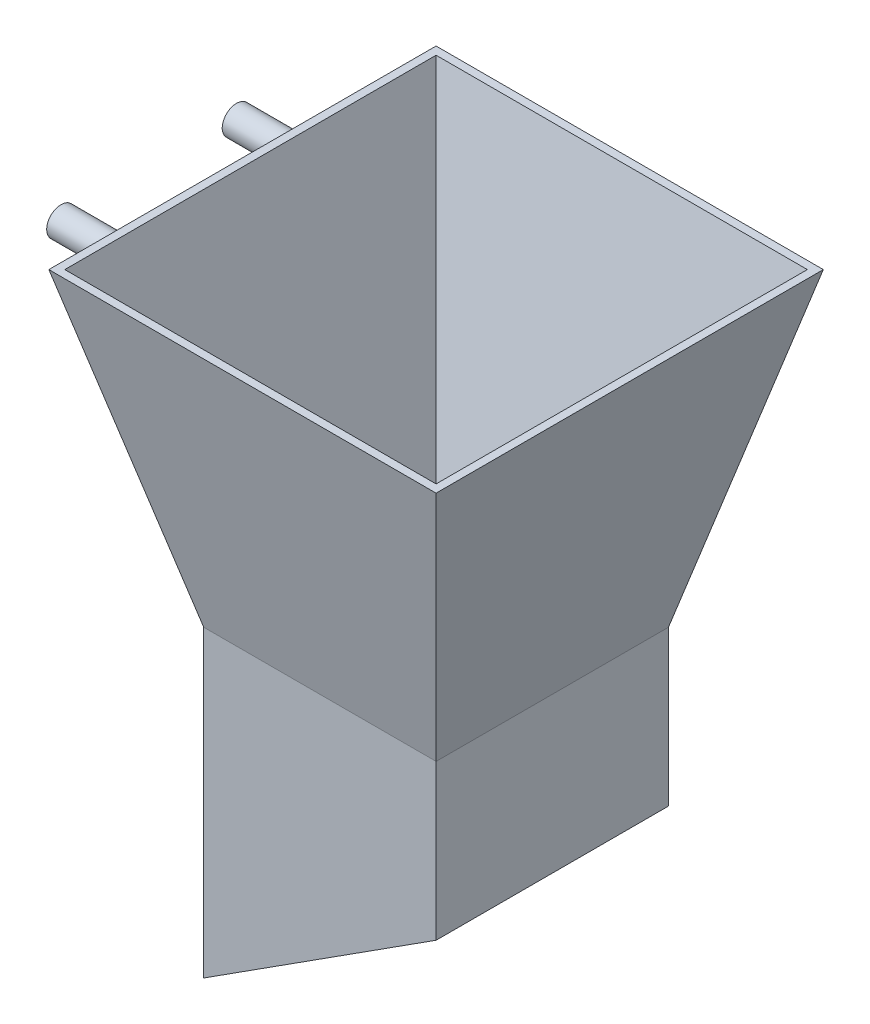
ISO-10303-21;
HEADER;
FILE_DESCRIPTION(('STEP AP214'),'2;1');
FILE_NAME('part.step','',(''),(''),'','','');
FILE_SCHEMA(('AUTOMOTIVE_DESIGN { 1 0 10303 214 1 1 1 1 }'));
ENDSEC;
DATA;
#1=APPLICATION_CONTEXT('core data for automotive mechanical design processes');
#2=APPLICATION_PROTOCOL_DEFINITION('international standard','automotive_design',2000,#1);
#3=PRODUCT_CONTEXT('',#1,'mechanical');
#4=PRODUCT('Part','Part','',(#3));
#5=PRODUCT_RELATED_PRODUCT_CATEGORY('part','',(#4));
#6=PRODUCT_DEFINITION_FORMATION('','',#4);
#7=PRODUCT_DEFINITION_CONTEXT('part definition',#1,'design');
#8=PRODUCT_DEFINITION('design','',#6,#7);
#9=PRODUCT_DEFINITION_SHAPE('','',#8);
#10=(LENGTH_UNIT() NAMED_UNIT(*) SI_UNIT(.MILLI.,.METRE.));
#11=(NAMED_UNIT(*) PLANE_ANGLE_UNIT() SI_UNIT($,.RADIAN.));
#12=(NAMED_UNIT(*) SI_UNIT($,.STERADIAN.) SOLID_ANGLE_UNIT());
#13=UNCERTAINTY_MEASURE_WITH_UNIT(LENGTH_MEASURE(1.E-05),#10,'distance_accuracy_value','');
#14=(GEOMETRIC_REPRESENTATION_CONTEXT(3) GLOBAL_UNCERTAINTY_ASSIGNED_CONTEXT((#13)) GLOBAL_UNIT_ASSIGNED_CONTEXT((#10,
#11,#12)) REPRESENTATION_CONTEXT('',''));
#15=CARTESIAN_POINT('',(0.,0.,0.));
#16=DIRECTION('',(0.,0.,1.));
#17=DIRECTION('',(1.,0.,0.));
#18=AXIS2_PLACEMENT_3D('',#15,#16,#17);
#19=CARTESIAN_POINT('',(-121.,-74.725401962788,-136.682880253871));
#20=DIRECTION('',(1.,0.,0.));
#21=DIRECTION('',(0.,0.,-1.));
#22=AXIS2_PLACEMENT_3D('',#19,#20,#21);
#23=CYLINDRICAL_SURFACE('',#22,18.4816077554572);
#24=CARTESIAN_POINT('',(-121.,-74.725401962788,-136.682880253871));
#25=DIRECTION('',(1.,0.,0.));
#26=DIRECTION('',(0.,0.,1.));
#27=AXIS2_PLACEMENT_3D('',#24,#25,#26);
#28=CIRCLE('',#27,18.4816077554572);
#29=CARTESIAN_POINT('',(-121.,-74.725401962788,-118.201272498414));
#30=VERTEX_POINT('',#29);
#31=EDGE_CURVE('E12',#30,#30,#28,.T.);
#32=ORIENTED_EDGE('',*,*,#31,.T.);
#33=EDGE_LOOP('',(#32));
#34=FACE_BOUND('',#33,.T.);
#35=CARTESIAN_POINT('',(10.,-74.725401962788,-136.682880253871));
#36=DIRECTION('',(1.,0.,0.));
#37=DIRECTION('',(0.,0.,1.));
#38=AXIS2_PLACEMENT_3D('',#35,#36,#37);
#39=CIRCLE('',#38,18.4816077554572);
#40=CARTESIAN_POINT('',(10.,-74.725401962788,-118.201272498414));
#41=VERTEX_POINT('',#40);
#42=EDGE_CURVE('E55',#41,#41,#39,.T.);
#43=ORIENTED_EDGE('',*,*,#42,.F.);
#44=EDGE_LOOP('',(#43));
#45=FACE_BOUND('',#44,.T.);
#46=ADVANCED_FACE('F49',(#34,#45),#23,.T.);
#47=CARTESIAN_POINT('',(-121.,-74.725401962788,-136.682880253871));
#48=DIRECTION('',(-1.,0.,0.));
#49=DIRECTION('',(0.,0.,1.));
#50=AXIS2_PLACEMENT_3D('',#47,#48,#49);
#51=PLANE('',#50);
#52=ORIENTED_EDGE('',*,*,#31,.F.);
#53=EDGE_LOOP('',(#52));
#54=FACE_BOUND('',#53,.T.);
#55=ADVANCED_FACE('F64',(#54),#51,.T.);
#56=CARTESIAN_POINT('',(10.,-74.725401962788,-136.682880253871));
#57=DIRECTION('',(-1.,0.,0.));
#58=DIRECTION('',(0.,0.,1.));
#59=AXIS2_PLACEMENT_3D('',#56,#57,#58);
#60=PLANE('',#59);
#61=ORIENTED_EDGE('',*,*,#42,.T.);
#62=EDGE_LOOP('',(#61));
#63=FACE_BOUND('',#62,.T.);
#64=ADVANCED_FACE('F61',(#63),#60,.F.);
#65=CLOSED_SHELL('',(#46,#55,#64));
#66=MANIFOLD_SOLID_BREP('B2',#65);
#67=CARTESIAN_POINT('',(-121.,-74.725401962788,-363.31711974613));
#68=DIRECTION('',(1.,0.,0.));
#69=DIRECTION('',(0.,0.,-1.));
#70=AXIS2_PLACEMENT_3D('',#67,#68,#69);
#71=CYLINDRICAL_SURFACE('',#70,18.4816077554572);
#72=CARTESIAN_POINT('',(-121.,-74.725401962788,-363.31711974613));
#73=DIRECTION('',(1.,0.,0.));
#74=DIRECTION('',(0.,0.,-1.));
#75=AXIS2_PLACEMENT_3D('',#72,#73,#74);
#76=CIRCLE('',#75,18.4816077554572);
#77=CARTESIAN_POINT('',(-121.,-74.725401962788,-381.798727501587));
#78=VERTEX_POINT('',#77);
#79=EDGE_CURVE('E48',#78,#78,#76,.T.);
#80=ORIENTED_EDGE('',*,*,#79,.T.);
#81=EDGE_LOOP('',(#80));
#82=FACE_BOUND('',#81,.T.);
#83=CARTESIAN_POINT('',(10.,-74.725401962788,-363.31711974613));
#84=DIRECTION('',(1.,0.,0.));
#85=DIRECTION('',(0.,0.,-1.));
#86=AXIS2_PLACEMENT_3D('',#83,#84,#85);
#87=CIRCLE('',#86,18.4816077554572);
#88=CARTESIAN_POINT('',(10.,-74.725401962788,-381.798727501587));
#89=VERTEX_POINT('',#88);
#90=EDGE_CURVE('E104',#89,#89,#87,.T.);
#91=ORIENTED_EDGE('',*,*,#90,.F.);
#92=EDGE_LOOP('',(#91));
#93=FACE_BOUND('',#92,.T.);
#94=ADVANCED_FACE('F98',(#82,#93),#71,.T.);
#95=CARTESIAN_POINT('',(-121.,-74.725401962788,-363.31711974613));
#96=DIRECTION('',(1.,0.,0.));
#97=DIRECTION('',(0.,0.,-1.));
#98=AXIS2_PLACEMENT_3D('',#95,#96,#97);
#99=PLANE('',#98);
#100=ORIENTED_EDGE('',*,*,#79,.F.);
#101=EDGE_LOOP('',(#100));
#102=FACE_BOUND('',#101,.T.);
#103=ADVANCED_FACE('F113',(#102),#99,.F.);
#104=CARTESIAN_POINT('',(10.,-74.725401962788,-363.31711974613));
#105=DIRECTION('',(1.,0.,0.));
#106=DIRECTION('',(0.,0.,-1.));
#107=AXIS2_PLACEMENT_3D('',#104,#105,#106);
#108=PLANE('',#107);
#109=ORIENTED_EDGE('',*,*,#90,.T.);
#110=EDGE_LOOP('',(#109));
#111=FACE_BOUND('',#110,.T.);
#112=ADVANCED_FACE('F110',(#111),#108,.T.);
#113=CLOSED_SHELL('',(#94,#103,#112));
#114=MANIFOLD_SOLID_BREP('B7',#113);
#115=CARTESIAN_POINT('',(0.,0.,0.));
#116=DIRECTION('',(0.,-1.,0.));
#117=DIRECTION('',(0.,0.,-1.));
#118=AXIS2_PLACEMENT_3D('',#115,#116,#117);
#119=PLANE('',#118);
#120=DIRECTION('',(0.,0.,1.));
#121=VECTOR('',#120,1.);
#122=CARTESIAN_POINT('',(0.,0.,0.));
#123=LINE('',#122,#121);
#124=CARTESIAN_POINT('',(0.,0.,-500.));
#125=VERTEX_POINT('',#124);
#126=CARTESIAN_POINT('',(0.,0.,0.));
#127=VERTEX_POINT('',#126);
#128=EDGE_CURVE('E337',#125,#127,#123,.T.);
#129=ORIENTED_EDGE('',*,*,#128,.T.);
#130=DIRECTION('',(1.,0.,0.));
#131=VECTOR('',#130,1.);
#132=CARTESIAN_POINT('',(0.,0.,0.));
#133=LINE('',#132,#131);
#134=CARTESIAN_POINT('',(500.,0.,0.));
#135=VERTEX_POINT('',#134);
#136=EDGE_CURVE('E312',#127,#135,#133,.T.);
#137=ORIENTED_EDGE('',*,*,#136,.T.);
#138=DIRECTION('',(0.,0.,-1.));
#139=VECTOR('',#138,1.);
#140=CARTESIAN_POINT('',(500.,0.,0.));
#141=LINE('',#140,#139);
#142=CARTESIAN_POINT('',(500.,0.,-500.));
#143=VERTEX_POINT('',#142);
#144=EDGE_CURVE('E378',#135,#143,#141,.T.);
#145=ORIENTED_EDGE('',*,*,#144,.T.);
#146=DIRECTION('',(-1.,0.,0.));
#147=VECTOR('',#146,1.);
#148=CARTESIAN_POINT('',(0.,0.,-500.));
#149=LINE('',#148,#147);
#150=EDGE_CURVE('E413',#143,#125,#149,.T.);
#151=ORIENTED_EDGE('',*,*,#150,.T.);
#152=EDGE_LOOP('',(#129,#137,#145,#151));
#153=FACE_BOUND('',#152,.T.);
#154=DIRECTION('',(0.,0.,1.));
#155=VECTOR('',#154,1.);
#156=CARTESIAN_POINT('',(10.3077640640442,0.,0.));
#157=LINE('',#156,#155);
#158=CARTESIAN_POINT('',(10.3077640640441,0.,-489.692235935956));
#159=VERTEX_POINT('',#158);
#160=CARTESIAN_POINT('',(10.3077640640442,0.,-10.3077640640441));
#161=VERTEX_POINT('',#160);
#162=EDGE_CURVE('E278',#159,#161,#157,.T.);
#163=ORIENTED_EDGE('',*,*,#162,.F.);
#164=DIRECTION('',(-1.,0.,0.));
#165=VECTOR('',#164,1.);
#166=CARTESIAN_POINT('',(0.,0.,-489.692235935956));
#167=LINE('',#166,#165);
#168=CARTESIAN_POINT('',(489.692235935956,0.,-489.692235935956));
#169=VERTEX_POINT('',#168);
#170=EDGE_CURVE('E291',#169,#159,#167,.T.);
#171=ORIENTED_EDGE('',*,*,#170,.F.);
#172=DIRECTION('',(0.,0.,-1.));
#173=VECTOR('',#172,1.);
#174=CARTESIAN_POINT('',(489.692235935956,0.,0.));
#175=LINE('',#174,#173);
#176=CARTESIAN_POINT('',(489.692235935956,0.,-10.3077640640441));
#177=VERTEX_POINT('',#176);
#178=EDGE_CURVE('E262',#177,#169,#175,.T.);
#179=ORIENTED_EDGE('',*,*,#178,.F.);
#180=DIRECTION('',(1.,0.,0.));
#181=VECTOR('',#180,1.);
#182=CARTESIAN_POINT('',(0.,0.,-10.3077640640441));
#183=LINE('',#182,#181);
#184=EDGE_CURVE('E264',#161,#177,#183,.T.);
#185=ORIENTED_EDGE('',*,*,#184,.F.);
#186=EDGE_LOOP('',(#163,#171,#179,#185));
#187=FACE_BOUND('',#186,.T.);
#188=ADVANCED_FACE('F138',(#153,#187),#119,.F.);
#189=CARTESIAN_POINT('',(0.,-117.64705882353,-470.588235294118));
#190=DIRECTION('',(0.,-0.242535625036333,-0.970142500145332));
#191=DIRECTION('',(0.,0.970142500145332,-0.242535625036333));
#192=AXIS2_PLACEMENT_3D('',#189,#190,#191);
#193=PLANE('',#192);
#194=DIRECTION('',(-0.235702260395516,-0.942809041582063,0.235702260395516));
#195=VECTOR('',#194,1.);
#196=CARTESIAN_POINT('',(500.,0.,-500.));
#197=LINE('',#196,#195);
#198=CARTESIAN_POINT('',(400.,-400.,-400.));
#199=VERTEX_POINT('',#198);
#200=EDGE_CURVE('E377',#143,#199,#197,.T.);
#201=ORIENTED_EDGE('',*,*,#200,.T.);
#202=DIRECTION('',(-1.,0.,0.));
#203=VECTOR('',#202,1.);
#204=CARTESIAN_POINT('',(100.,-400.,-400.));
#205=LINE('',#204,#203);
#206=CARTESIAN_POINT('',(100.,-400.,-400.));
#207=VERTEX_POINT('',#206);
#208=EDGE_CURVE('E96',#199,#207,#205,.T.);
#209=ORIENTED_EDGE('',*,*,#208,.T.);
#210=DIRECTION('',(0.235702260395516,-0.942809041582063,0.235702260395516));
#211=VECTOR('',#210,1.);
#212=CARTESIAN_POINT('',(0.,0.,-500.));
#213=LINE('',#212,#211);
#214=EDGE_CURVE('E330',#125,#207,#213,.T.);
#215=ORIENTED_EDGE('',*,*,#214,.F.);
#216=ORIENTED_EDGE('',*,*,#150,.F.);
#217=EDGE_LOOP('',(#201,#209,#215,#216));
#218=FACE_BOUND('',#217,.T.);
#219=ADVANCED_FACE('F354',(#218),#193,.T.);
#220=CARTESIAN_POINT('',(0.,0.,0.));
#221=DIRECTION('',(-0.970142500145332,-0.242535625036333,0.));
#222=DIRECTION('',(0.242535625036333,-0.970142500145332,0.));
#223=AXIS2_PLACEMENT_3D('',#220,#221,#222);
#224=PLANE('',#223);
#225=ORIENTED_EDGE('',*,*,#214,.T.);
#226=DIRECTION('',(0.,0.,1.));
#227=VECTOR('',#226,1.);
#228=CARTESIAN_POINT('',(100.,-400.,-400.));
#229=LINE('',#228,#227);
#230=CARTESIAN_POINT('',(100.,-400.,-100.));
#231=VERTEX_POINT('',#230);
#232=EDGE_CURVE('E143',#207,#231,#229,.T.);
#233=ORIENTED_EDGE('',*,*,#232,.T.);
#234=DIRECTION('',(0.235702260395516,-0.942809041582063,-0.235702260395516));
#235=VECTOR('',#234,1.);
#236=CARTESIAN_POINT('',(0.,0.,0.));
#237=LINE('',#236,#235);
#238=EDGE_CURVE('E317',#127,#231,#237,.T.);
#239=ORIENTED_EDGE('',*,*,#238,.F.);
#240=ORIENTED_EDGE('',*,*,#128,.F.);
#241=EDGE_LOOP('',(#225,#233,#239,#240));
#242=FACE_BOUND('',#241,.T.);
#243=ADVANCED_FACE('F344',(#242),#224,.T.);
#244=CARTESIAN_POINT('',(470.588235294118,-117.647058823529,0.));
#245=DIRECTION('',(0.970142500145332,-0.242535625036333,0.));
#246=DIRECTION('',(0.242535625036333,0.970142500145332,0.));
#247=AXIS2_PLACEMENT_3D('',#244,#245,#246);
#248=PLANE('',#247);
#249=DIRECTION('',(-0.235702260395516,-0.942809041582063,-0.235702260395516));
#250=VECTOR('',#249,1.);
#251=CARTESIAN_POINT('',(500.,0.,0.));
#252=LINE('',#251,#250);
#253=CARTESIAN_POINT('',(400.,-400.,-100.));
#254=VERTEX_POINT('',#253);
#255=EDGE_CURVE('E325',#135,#254,#252,.T.);
#256=ORIENTED_EDGE('',*,*,#255,.T.);
#257=DIRECTION('',(0.,0.,-1.));
#258=VECTOR('',#257,1.);
#259=CARTESIAN_POINT('',(400.,-400.,-400.));
#260=LINE('',#259,#258);
#261=EDGE_CURVE('E324',#254,#199,#260,.T.);
#262=ORIENTED_EDGE('',*,*,#261,.T.);
#263=ORIENTED_EDGE('',*,*,#200,.F.);
#264=ORIENTED_EDGE('',*,*,#144,.F.);
#265=EDGE_LOOP('',(#256,#262,#263,#264));
#266=FACE_BOUND('',#265,.T.);
#267=ADVANCED_FACE('F353',(#266),#248,.T.);
#268=CARTESIAN_POINT('',(0.,0.,0.));
#269=DIRECTION('',(0.,-0.242535625036333,0.970142500145332));
#270=DIRECTION('',(0.,-0.970142500145332,-0.242535625036333));
#271=AXIS2_PLACEMENT_3D('',#268,#269,#270);
#272=PLANE('',#271);
#273=ORIENTED_EDGE('',*,*,#238,.T.);
#274=DIRECTION('',(1.,0.,0.));
#275=VECTOR('',#274,1.);
#276=CARTESIAN_POINT('',(100.,-400.,-99.9999999999999));
#277=LINE('',#276,#275);
#278=EDGE_CURVE('E455',#231,#254,#277,.T.);
#279=ORIENTED_EDGE('',*,*,#278,.T.);
#280=ORIENTED_EDGE('',*,*,#255,.F.);
#281=ORIENTED_EDGE('',*,*,#136,.F.);
#282=EDGE_LOOP('',(#273,#279,#280,#281));
#283=FACE_BOUND('',#282,.T.);
#284=ADVANCED_FACE('F140',(#283),#272,.T.);
#285=CARTESIAN_POINT('',(400.,-600.,-100.));
#286=DIRECTION('',(-1.,0.,0.));
#287=DIRECTION('',(0.,0.,1.));
#288=AXIS2_PLACEMENT_3D('',#285,#286,#287);
#289=PLANE('',#288);
#290=ORIENTED_EDGE('',*,*,#261,.F.);
#291=DIRECTION('',(0.,1.,0.));
#292=VECTOR('',#291,1.);
#293=CARTESIAN_POINT('',(400.,-600.,-100.));
#294=LINE('',#293,#292);
#295=CARTESIAN_POINT('',(400.,-600.,-100.));
#296=VERTEX_POINT('',#295);
#297=EDGE_CURVE('E444',#296,#254,#294,.T.);
#298=ORIENTED_EDGE('',*,*,#297,.F.);
#299=DIRECTION('',(0.,0.,1.));
#300=VECTOR('',#299,1.);
#301=CARTESIAN_POINT('',(400.,-600.,-100.));
#302=LINE('',#301,#300);
#303=CARTESIAN_POINT('',(400.,-600.,-400.));
#304=VERTEX_POINT('',#303);
#305=EDGE_CURVE('E298',#304,#296,#302,.T.);
#306=ORIENTED_EDGE('',*,*,#305,.F.);
#307=DIRECTION('',(0.,1.,0.));
#308=VECTOR('',#307,1.);
#309=CARTESIAN_POINT('',(400.,-600.,-400.));
#310=LINE('',#309,#308);
#311=EDGE_CURVE('E306',#304,#199,#310,.T.);
#312=ORIENTED_EDGE('',*,*,#311,.T.);
#313=EDGE_LOOP('',(#290,#298,#306,#312));
#314=FACE_BOUND('',#313,.T.);
#315=ADVANCED_FACE('F398',(#314),#289,.F.);
#316=CARTESIAN_POINT('',(100.,-600.,-100.));
#317=DIRECTION('',(0.,0.,-1.));
#318=DIRECTION('',(-1.,0.,0.));
#319=AXIS2_PLACEMENT_3D('',#316,#317,#318);
#320=PLANE('',#319);
#321=ORIENTED_EDGE('',*,*,#278,.F.);
#322=DIRECTION('',(0.,1.,0.));
#323=VECTOR('',#322,1.);
#324=CARTESIAN_POINT('',(100.,-600.,-100.));
#325=LINE('',#324,#323);
#326=CARTESIAN_POINT('',(100.,-792.175192929181,-100.));
#327=VERTEX_POINT('',#326);
#328=EDGE_CURVE('E451',#327,#231,#325,.T.);
#329=ORIENTED_EDGE('',*,*,#328,.F.);
#330=DIRECTION('',(0.842048065661697,0.539402498247269,0.));
#331=VECTOR('',#330,1.);
#332=CARTESIAN_POINT('',(100.,-792.175192929181,-100.));
#333=LINE('',#332,#331);
#334=EDGE_CURVE('E235',#327,#296,#333,.T.);
#335=ORIENTED_EDGE('',*,*,#334,.T.);
#336=ORIENTED_EDGE('',*,*,#297,.T.);
#337=EDGE_LOOP('',(#321,#329,#335,#336));
#338=FACE_BOUND('',#337,.T.);
#339=ADVANCED_FACE('F482',(#338),#320,.F.);
#340=CARTESIAN_POINT('',(100.,-600.,-100.));
#341=DIRECTION('',(1.,0.,0.));
#342=DIRECTION('',(0.,0.,-1.));
#343=AXIS2_PLACEMENT_3D('',#340,#341,#342);
#344=PLANE('',#343);
#345=ORIENTED_EDGE('',*,*,#232,.F.);
#346=DIRECTION('',(0.,1.,0.));
#347=VECTOR('',#346,1.);
#348=CARTESIAN_POINT('',(100.,-600.,-400.));
#349=LINE('',#348,#347);
#350=CARTESIAN_POINT('',(100.,-792.175192929181,-400.));
#351=VERTEX_POINT('',#350);
#352=EDGE_CURVE('E164',#351,#207,#349,.T.);
#353=ORIENTED_EDGE('',*,*,#352,.F.);
#354=DIRECTION('',(0.,0.,1.));
#355=VECTOR('',#354,1.);
#356=CARTESIAN_POINT('',(100.,-792.175192929181,-756.27419886566));
#357=LINE('',#356,#355);
#358=EDGE_CURVE('E299',#351,#327,#357,.T.);
#359=ORIENTED_EDGE('',*,*,#358,.T.);
#360=ORIENTED_EDGE('',*,*,#328,.T.);
#361=EDGE_LOOP('',(#345,#353,#359,#360));
#362=FACE_BOUND('',#361,.T.);
#363=ADVANCED_FACE('F472',(#362),#344,.F.);
#364=CARTESIAN_POINT('',(100.,-600.,-400.));
#365=DIRECTION('',(0.,0.,1.));
#366=DIRECTION('',(1.,0.,0.));
#367=AXIS2_PLACEMENT_3D('',#364,#365,#366);
#368=PLANE('',#367);
#369=ORIENTED_EDGE('',*,*,#208,.F.);
#370=ORIENTED_EDGE('',*,*,#311,.F.);
#371=DIRECTION('',(-0.842048065661697,-0.539402498247269,0.));
#372=VECTOR('',#371,1.);
#373=CARTESIAN_POINT('',(100.,-792.175192929181,-400.));
#374=LINE('',#373,#372);
#375=EDGE_CURVE('E296',#304,#351,#374,.T.);
#376=ORIENTED_EDGE('',*,*,#375,.T.);
#377=ORIENTED_EDGE('',*,*,#352,.T.);
#378=EDGE_LOOP('',(#369,#370,#376,#377));
#379=FACE_BOUND('',#378,.T.);
#380=ADVANCED_FACE('F481',(#379),#368,.F.);
#381=CARTESIAN_POINT('',(100.,-792.175192929181,-756.27419886566));
#382=DIRECTION('',(0.539402498247269,-0.842048065661697,0.));
#383=DIRECTION('',(0.842048065661697,0.539402498247269,0.));
#384=AXIS2_PLACEMENT_3D('',#381,#382,#383);
#385=PLANE('',#384);
#386=ORIENTED_EDGE('',*,*,#375,.F.);
#387=ORIENTED_EDGE('',*,*,#305,.T.);
#388=ORIENTED_EDGE('',*,*,#334,.F.);
#389=ORIENTED_EDGE('',*,*,#358,.F.);
#390=EDGE_LOOP('',(#386,#387,#388,#389));
#391=FACE_BOUND('',#390,.T.);
#392=ADVANCED_FACE('F587',(#391),#385,.T.);
#393=CARTESIAN_POINT('',(0.,-115.221702573166,-460.886810292664));
#394=DIRECTION('',(0.,-0.242535625036333,-0.970142500145332));
#395=DIRECTION('',(0.,0.970142500145332,-0.242535625036333));
#396=AXIS2_PLACEMENT_3D('',#393,#394,#395);
#397=PLANE('',#396);
#398=DIRECTION('',(-0.235702260395516,-0.942809041582063,0.235702260395516));
#399=VECTOR('',#398,1.);
#400=CARTESIAN_POINT('',(435.281987498627,-217.640993749314,-435.281987498627));
#401=LINE('',#400,#399);
#402=CARTESIAN_POINT('',(390.,-398.768943743823,-390.));
#403=VERTEX_POINT('',#402);
#404=EDGE_CURVE('E156',#169,#403,#401,.T.);
#405=ORIENTED_EDGE('',*,*,#404,.F.);
#406=ORIENTED_EDGE('',*,*,#170,.T.);
#407=DIRECTION('',(0.235702260395516,-0.942809041582063,0.235702260395516));
#408=VECTOR('',#407,1.);
#409=CARTESIAN_POINT('',(36.9402347235948,-106.529882638203,-463.059765276405));
#410=LINE('',#409,#408);
#411=CARTESIAN_POINT('',(110.,-398.768943743824,-390.));
#412=VERTEX_POINT('',#411);
#413=EDGE_CURVE('E233',#159,#412,#410,.T.);
#414=ORIENTED_EDGE('',*,*,#413,.T.);
#415=DIRECTION('',(-1.,0.,0.));
#416=VECTOR('',#415,1.);
#417=CARTESIAN_POINT('',(0.,-398.768943743824,-390.));
#418=LINE('',#417,#416);
#419=EDGE_CURVE('E229',#403,#412,#418,.T.);
#420=ORIENTED_EDGE('',*,*,#419,.F.);
#421=EDGE_LOOP('',(#405,#406,#414,#420));
#422=FACE_BOUND('',#421,.T.);
#423=ADVANCED_FACE('F231',(#422),#397,.F.);
#424=CARTESIAN_POINT('',(9.70142500145337,2.42535625036334,0.));
#425=DIRECTION('',(-0.970142500145332,-0.242535625036333,0.));
#426=DIRECTION('',(0.242535625036333,-0.970142500145332,0.));
#427=AXIS2_PLACEMENT_3D('',#424,#425,#426);
#428=PLANE('',#427);
#429=ORIENTED_EDGE('',*,*,#413,.F.);
#430=ORIENTED_EDGE('',*,*,#162,.T.);
#431=DIRECTION('',(0.235702260395516,-0.942809041582063,-0.235702260395516));
#432=VECTOR('',#431,1.);
#433=CARTESIAN_POINT('',(9.16245694581708,4.58122847290852,-9.16245694581701));
#434=LINE('',#433,#432);
#435=CARTESIAN_POINT('',(110.,-398.768943743824,-110.));
#436=VERTEX_POINT('',#435);
#437=EDGE_CURVE('E258',#161,#436,#434,.T.);
#438=ORIENTED_EDGE('',*,*,#437,.T.);
#439=DIRECTION('',(0.,0.,1.));
#440=VECTOR('',#439,1.);
#441=CARTESIAN_POINT('',(110.,-398.768943743823,2.21361231424923E-13));
#442=LINE('',#441,#440);
#443=EDGE_CURVE('E236',#412,#436,#442,.T.);
#444=ORIENTED_EDGE('',*,*,#443,.F.);
#445=EDGE_LOOP('',(#429,#430,#438,#444));
#446=FACE_BOUND('',#445,.T.);
#447=ADVANCED_FACE('F558',(#446),#428,.F.);
#448=CARTESIAN_POINT('',(460.886810292664,-115.221702573166,0.));
#449=DIRECTION('',(0.970142500145332,-0.242535625036333,0.));
#450=DIRECTION('',(0.242535625036333,0.970142500145332,0.));
#451=AXIS2_PLACEMENT_3D('',#448,#449,#450);
#452=PLANE('',#451);
#453=DIRECTION('',(-0.235702260395516,-0.942809041582063,-0.235702260395516));
#454=VECTOR('',#453,1.);
#455=CARTESIAN_POINT('',(463.059765276405,-106.529882638203,-36.9402347235948));
#456=LINE('',#455,#454);
#457=CARTESIAN_POINT('',(390.,-398.768943743824,-110.));
#458=VERTEX_POINT('',#457);
#459=EDGE_CURVE('E266',#177,#458,#456,.T.);
#460=ORIENTED_EDGE('',*,*,#459,.F.);
#461=ORIENTED_EDGE('',*,*,#178,.T.);
#462=ORIENTED_EDGE('',*,*,#404,.T.);
#463=DIRECTION('',(0.,0.,-1.));
#464=VECTOR('',#463,1.);
#465=CARTESIAN_POINT('',(390.,-398.768943743824,-2.95148308566565E-13));
#466=LINE('',#465,#464);
#467=EDGE_CURVE('E251',#458,#403,#466,.T.);
#468=ORIENTED_EDGE('',*,*,#467,.F.);
#469=EDGE_LOOP('',(#460,#461,#462,#468));
#470=FACE_BOUND('',#469,.T.);
#471=ADVANCED_FACE('F260',(#470),#452,.F.);
#472=CARTESIAN_POINT('',(0.,2.42535625036332,-9.70142500145331));
#473=DIRECTION('',(0.,-0.242535625036333,0.970142500145332));
#474=DIRECTION('',(0.,-0.970142500145332,-0.242535625036333));
#475=AXIS2_PLACEMENT_3D('',#472,#473,#474);
#476=PLANE('',#475);
#477=ORIENTED_EDGE('',*,*,#437,.F.);
#478=ORIENTED_EDGE('',*,*,#184,.T.);
#479=ORIENTED_EDGE('',*,*,#459,.T.);
#480=DIRECTION('',(1.,0.,0.));
#481=VECTOR('',#480,1.);
#482=CARTESIAN_POINT('',(0.,-398.768943743824,-110.));
#483=LINE('',#482,#481);
#484=EDGE_CURVE('E257',#436,#458,#483,.T.);
#485=ORIENTED_EDGE('',*,*,#484,.F.);
#486=EDGE_LOOP('',(#477,#478,#479,#485));
#487=FACE_BOUND('',#486,.T.);
#488=ADVANCED_FACE('F569',(#487),#476,.F.);
#489=CARTESIAN_POINT('',(390.,-600.,-100.));
#490=DIRECTION('',(-1.,0.,0.));
#491=DIRECTION('',(0.,0.,1.));
#492=AXIS2_PLACEMENT_3D('',#489,#490,#491);
#493=PLANE('',#492);
#494=ORIENTED_EDGE('',*,*,#467,.T.);
#495=DIRECTION('',(0.,1.,0.));
#496=VECTOR('',#495,1.);
#497=CARTESIAN_POINT('',(390.,-600.,-390.));
#498=LINE('',#497,#496);
#499=CARTESIAN_POINT('',(390.,-594.530033135451,-390.));
#500=VERTEX_POINT('',#499);
#501=EDGE_CURVE('E240',#500,#403,#498,.T.);
#502=ORIENTED_EDGE('',*,*,#501,.F.);
#503=DIRECTION('',(0.,0.,1.));
#504=VECTOR('',#503,1.);
#505=CARTESIAN_POINT('',(390.,-594.530033135451,-100.));
#506=LINE('',#505,#504);
#507=CARTESIAN_POINT('',(390.,-594.530033135451,-110.));
#508=VERTEX_POINT('',#507);
#509=EDGE_CURVE('E248',#500,#508,#506,.T.);
#510=ORIENTED_EDGE('',*,*,#509,.T.);
#511=DIRECTION('',(0.,1.,0.));
#512=VECTOR('',#511,1.);
#513=CARTESIAN_POINT('',(390.,-600.,-110.));
#514=LINE('',#513,#512);
#515=EDGE_CURVE('E253',#508,#458,#514,.T.);
#516=ORIENTED_EDGE('',*,*,#515,.T.);
#517=EDGE_LOOP('',(#494,#502,#510,#516));
#518=FACE_BOUND('',#517,.T.);
#519=ADVANCED_FACE('F252',(#518),#493,.T.);
#520=CARTESIAN_POINT('',(100.,-600.,-110.));
#521=DIRECTION('',(0.,0.,-1.));
#522=DIRECTION('',(-1.,0.,0.));
#523=AXIS2_PLACEMENT_3D('',#520,#521,#522);
#524=PLANE('',#523);
#525=ORIENTED_EDGE('',*,*,#484,.T.);
#526=ORIENTED_EDGE('',*,*,#515,.F.);
#527=DIRECTION('',(0.842048065661697,0.539402498247269,0.));
#528=VECTOR('',#527,1.);
#529=CARTESIAN_POINT('',(94.6059750175274,-783.754712272564,-110.));
#530=LINE('',#529,#528);
#531=CARTESIAN_POINT('',(110.,-773.89354653602,-110.));
#532=VERTEX_POINT('',#531);
#533=EDGE_CURVE('E283',#532,#508,#530,.T.);
#534=ORIENTED_EDGE('',*,*,#533,.F.);
#535=DIRECTION('',(0.,1.,0.));
#536=VECTOR('',#535,1.);
#537=CARTESIAN_POINT('',(110.,-600.,-110.));
#538=LINE('',#537,#536);
#539=EDGE_CURVE('E279',#532,#436,#538,.T.);
#540=ORIENTED_EDGE('',*,*,#539,.T.);
#541=EDGE_LOOP('',(#525,#526,#534,#540));
#542=FACE_BOUND('',#541,.T.);
#543=ADVANCED_FACE('F567',(#542),#524,.T.);
#544=CARTESIAN_POINT('',(110.,-600.,-100.));
#545=DIRECTION('',(1.,0.,0.));
#546=DIRECTION('',(0.,0.,-1.));
#547=AXIS2_PLACEMENT_3D('',#544,#545,#546);
#548=PLANE('',#547);
#549=ORIENTED_EDGE('',*,*,#443,.T.);
#550=ORIENTED_EDGE('',*,*,#539,.F.);
#551=DIRECTION('',(0.,0.,1.));
#552=VECTOR('',#551,1.);
#553=CARTESIAN_POINT('',(110.,-773.89354653602,-756.27419886566));
#554=LINE('',#553,#552);
#555=CARTESIAN_POINT('',(110.,-773.89354653602,-390.));
#556=VERTEX_POINT('',#555);
#557=EDGE_CURVE('E286',#556,#532,#554,.T.);
#558=ORIENTED_EDGE('',*,*,#557,.F.);
#559=DIRECTION('',(0.,1.,0.));
#560=VECTOR('',#559,1.);
#561=CARTESIAN_POINT('',(110.,-600.,-390.));
#562=LINE('',#561,#560);
#563=EDGE_CURVE('E247',#556,#412,#562,.T.);
#564=ORIENTED_EDGE('',*,*,#563,.T.);
#565=EDGE_LOOP('',(#549,#550,#558,#564));
#566=FACE_BOUND('',#565,.T.);
#567=ADVANCED_FACE('F561',(#566),#548,.T.);
#568=CARTESIAN_POINT('',(100.,-600.,-390.));
#569=DIRECTION('',(0.,0.,1.));
#570=DIRECTION('',(1.,0.,0.));
#571=AXIS2_PLACEMENT_3D('',#568,#569,#570);
#572=PLANE('',#571);
#573=ORIENTED_EDGE('',*,*,#419,.T.);
#574=ORIENTED_EDGE('',*,*,#563,.F.);
#575=DIRECTION('',(-0.842048065661697,-0.539402498247269,0.));
#576=VECTOR('',#575,1.);
#577=CARTESIAN_POINT('',(94.6059750175274,-783.754712272564,-390.));
#578=LINE('',#577,#576);
#579=EDGE_CURVE('E244',#500,#556,#578,.T.);
#580=ORIENTED_EDGE('',*,*,#579,.F.);
#581=ORIENTED_EDGE('',*,*,#501,.T.);
#582=EDGE_LOOP('',(#573,#574,#580,#581));
#583=FACE_BOUND('',#582,.T.);
#584=ADVANCED_FACE('F242',(#583),#572,.T.);
#585=CARTESIAN_POINT('',(94.6059750175274,-783.754712272564,-756.27419886566));
#586=DIRECTION('',(0.539402498247269,-0.842048065661697,0.));
#587=DIRECTION('',(0.842048065661697,0.539402498247269,0.));
#588=AXIS2_PLACEMENT_3D('',#585,#586,#587);
#589=PLANE('',#588);
#590=ORIENTED_EDGE('',*,*,#579,.T.);
#591=ORIENTED_EDGE('',*,*,#557,.T.);
#592=ORIENTED_EDGE('',*,*,#533,.T.);
#593=ORIENTED_EDGE('',*,*,#509,.F.);
#594=EDGE_LOOP('',(#590,#591,#592,#593));
#595=FACE_BOUND('',#594,.T.);
#596=ADVANCED_FACE('F564',(#595),#589,.F.);
#597=CLOSED_SHELL('',(#188,#219,#243,#267,#284,#315,#339,#363,#380,#392,#423,#447,#471,#488,
#519,#543,#567,#584,#596));
#598=MANIFOLD_SOLID_BREP('B43',#597);
#599=ADVANCED_BREP_SHAPE_REPRESENTATION('',(#18,#66,#114,#598),#14);
#600=SHAPE_DEFINITION_REPRESENTATION(#9,#599);
ENDSEC;
END-ISO-10303-21;
